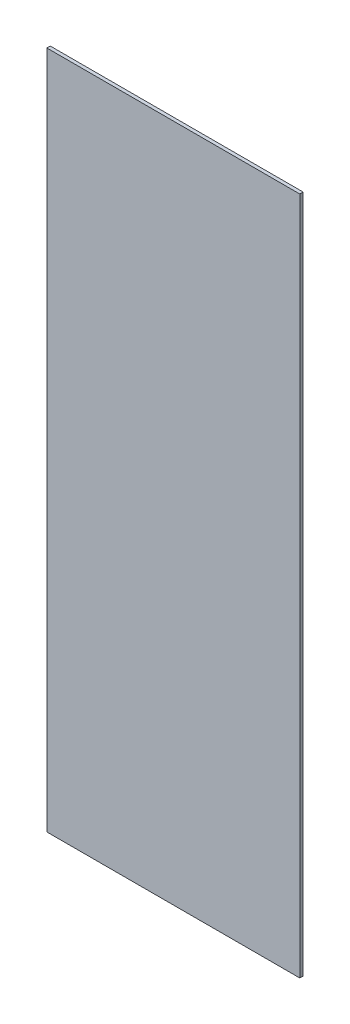
ISO-10303-21;
HEADER;
FILE_DESCRIPTION(('STEP AP214'),'2;1');
FILE_NAME('part.step','',(''),(''),'','','');
FILE_SCHEMA(('AUTOMOTIVE_DESIGN { 1 0 10303 214 1 1 1 1 }'));
ENDSEC;
DATA;
#1=APPLICATION_CONTEXT('core data for automotive mechanical design processes');
#2=APPLICATION_PROTOCOL_DEFINITION('international standard','automotive_design',2000,#1);
#3=PRODUCT_CONTEXT('',#1,'mechanical');
#4=PRODUCT('Part','Part','',(#3));
#5=PRODUCT_RELATED_PRODUCT_CATEGORY('part','',(#4));
#6=PRODUCT_DEFINITION_FORMATION('','',#4);
#7=PRODUCT_DEFINITION_CONTEXT('part definition',#1,'design');
#8=PRODUCT_DEFINITION('design','',#6,#7);
#9=PRODUCT_DEFINITION_SHAPE('','',#8);
#10=(LENGTH_UNIT() NAMED_UNIT(*) SI_UNIT(.MILLI.,.METRE.));
#11=(NAMED_UNIT(*) PLANE_ANGLE_UNIT() SI_UNIT($,.RADIAN.));
#12=(NAMED_UNIT(*) SI_UNIT($,.STERADIAN.) SOLID_ANGLE_UNIT());
#13=UNCERTAINTY_MEASURE_WITH_UNIT(LENGTH_MEASURE(1.E-05),#10,'distance_accuracy_value','');
#14=(GEOMETRIC_REPRESENTATION_CONTEXT(3) GLOBAL_UNCERTAINTY_ASSIGNED_CONTEXT((#13)) GLOBAL_UNIT_ASSIGNED_CONTEXT((#10,
#11,#12)) REPRESENTATION_CONTEXT('',''));
#15=CARTESIAN_POINT('',(0.,0.,0.));
#16=DIRECTION('',(0.,0.,1.));
#17=DIRECTION('',(1.,0.,0.));
#18=AXIS2_PLACEMENT_3D('',#15,#16,#17);
#19=CARTESIAN_POINT('',(74.5,200.,2.));
#20=DIRECTION('',(-1.,0.,0.));
#21=DIRECTION('',(0.,-1.,0.));
#22=AXIS2_PLACEMENT_3D('',#19,#20,#21);
#23=PLANE('',#22);
#24=DIRECTION('',(0.,1.,0.));
#25=VECTOR('',#24,1.);
#26=CARTESIAN_POINT('',(74.5,200.,0.));
#27=LINE('',#26,#25);
#28=CARTESIAN_POINT('',(74.5,-200.,0.));
#29=VERTEX_POINT('',#28);
#30=CARTESIAN_POINT('',(74.5,200.,0.));
#31=VERTEX_POINT('',#30);
#32=EDGE_CURVE('E96',#29,#31,#27,.T.);
#33=ORIENTED_EDGE('',*,*,#32,.T.);
#34=DIRECTION('',(0.,0.,-1.));
#35=VECTOR('',#34,1.);
#36=CARTESIAN_POINT('',(74.5,200.,2.));
#37=LINE('',#36,#35);
#38=CARTESIAN_POINT('',(74.5,200.,2.));
#39=VERTEX_POINT('',#38);
#40=EDGE_CURVE('E11',#39,#31,#37,.T.);
#41=ORIENTED_EDGE('',*,*,#40,.F.);
#42=DIRECTION('',(0.,1.,0.));
#43=VECTOR('',#42,1.);
#44=CARTESIAN_POINT('',(74.5,200.,2.));
#45=LINE('',#44,#43);
#46=CARTESIAN_POINT('',(74.5,-200.,2.));
#47=VERTEX_POINT('',#46);
#48=EDGE_CURVE('E84',#47,#39,#45,.T.);
#49=ORIENTED_EDGE('',*,*,#48,.F.);
#50=DIRECTION('',(0.,0.,-1.));
#51=VECTOR('',#50,1.);
#52=CARTESIAN_POINT('',(74.5,-200.,2.));
#53=LINE('',#52,#51);
#54=EDGE_CURVE('E92',#47,#29,#53,.T.);
#55=ORIENTED_EDGE('',*,*,#54,.T.);
#56=EDGE_LOOP('',(#33,#41,#49,#55));
#57=FACE_BOUND('',#56,.T.);
#58=ADVANCED_FACE('F33',(#57),#23,.F.);
#59=CARTESIAN_POINT('',(-74.5,200.,2.));
#60=DIRECTION('',(0.,-1.,0.));
#61=DIRECTION('',(1.,0.,0.));
#62=AXIS2_PLACEMENT_3D('',#59,#60,#61);
#63=PLANE('',#62);
#64=DIRECTION('',(-1.,0.,0.));
#65=VECTOR('',#64,1.);
#66=CARTESIAN_POINT('',(-74.5,200.,0.));
#67=LINE('',#66,#65);
#68=CARTESIAN_POINT('',(-74.5,200.,0.));
#69=VERTEX_POINT('',#68);
#70=EDGE_CURVE('E88',#31,#69,#67,.T.);
#71=ORIENTED_EDGE('',*,*,#70,.T.);
#72=DIRECTION('',(0.,0.,-1.));
#73=VECTOR('',#72,1.);
#74=CARTESIAN_POINT('',(-74.5,200.,2.));
#75=LINE('',#74,#73);
#76=CARTESIAN_POINT('',(-74.5,200.,2.));
#77=VERTEX_POINT('',#76);
#78=EDGE_CURVE('E41',#77,#69,#75,.T.);
#79=ORIENTED_EDGE('',*,*,#78,.F.);
#80=DIRECTION('',(-1.,0.,0.));
#81=VECTOR('',#80,1.);
#82=CARTESIAN_POINT('',(-74.5,200.,2.));
#83=LINE('',#82,#81);
#84=EDGE_CURVE('E79',#39,#77,#83,.T.);
#85=ORIENTED_EDGE('',*,*,#84,.F.);
#86=ORIENTED_EDGE('',*,*,#40,.T.);
#87=EDGE_LOOP('',(#71,#79,#85,#86));
#88=FACE_BOUND('',#87,.T.);
#89=ADVANCED_FACE('F87',(#88),#63,.F.);
#90=CARTESIAN_POINT('',(-74.5,200.,2.));
#91=DIRECTION('',(1.,0.,0.));
#92=DIRECTION('',(0.,1.,0.));
#93=AXIS2_PLACEMENT_3D('',#90,#91,#92);
#94=PLANE('',#93);
#95=DIRECTION('',(0.,-1.,0.));
#96=VECTOR('',#95,1.);
#97=CARTESIAN_POINT('',(-74.5,200.,0.));
#98=LINE('',#97,#96);
#99=CARTESIAN_POINT('',(-74.5,-200.,0.));
#100=VERTEX_POINT('',#99);
#101=EDGE_CURVE('E66',#69,#100,#98,.T.);
#102=ORIENTED_EDGE('',*,*,#101,.T.);
#103=DIRECTION('',(0.,0.,-1.));
#104=VECTOR('',#103,1.);
#105=CARTESIAN_POINT('',(-74.5,-200.,2.));
#106=LINE('',#105,#104);
#107=CARTESIAN_POINT('',(-74.5,-200.,2.));
#108=VERTEX_POINT('',#107);
#109=EDGE_CURVE('E89',#108,#100,#106,.T.);
#110=ORIENTED_EDGE('',*,*,#109,.F.);
#111=DIRECTION('',(0.,-1.,0.));
#112=VECTOR('',#111,1.);
#113=CARTESIAN_POINT('',(-74.5,200.,2.));
#114=LINE('',#113,#112);
#115=EDGE_CURVE('E82',#77,#108,#114,.T.);
#116=ORIENTED_EDGE('',*,*,#115,.F.);
#117=ORIENTED_EDGE('',*,*,#78,.T.);
#118=EDGE_LOOP('',(#102,#110,#116,#117));
#119=FACE_BOUND('',#118,.T.);
#120=ADVANCED_FACE('F90',(#119),#94,.F.);
#121=CARTESIAN_POINT('',(-74.5,-200.,2.));
#122=DIRECTION('',(0.,1.,0.));
#123=DIRECTION('',(0.,0.,1.));
#124=AXIS2_PLACEMENT_3D('',#121,#122,#123);
#125=PLANE('',#124);
#126=DIRECTION('',(1.,0.,0.));
#127=VECTOR('',#126,1.);
#128=CARTESIAN_POINT('',(-74.5,-200.,0.));
#129=LINE('',#128,#127);
#130=EDGE_CURVE('E72',#100,#29,#129,.T.);
#131=ORIENTED_EDGE('',*,*,#130,.T.);
#132=ORIENTED_EDGE('',*,*,#54,.F.);
#133=DIRECTION('',(1.,0.,0.));
#134=VECTOR('',#133,1.);
#135=CARTESIAN_POINT('',(-74.5,-200.,2.));
#136=LINE('',#135,#134);
#137=EDGE_CURVE('E49',#108,#47,#136,.T.);
#138=ORIENTED_EDGE('',*,*,#137,.F.);
#139=ORIENTED_EDGE('',*,*,#109,.T.);
#140=EDGE_LOOP('',(#131,#132,#138,#139));
#141=FACE_BOUND('',#140,.T.);
#142=ADVANCED_FACE('F103',(#141),#125,.F.);
#143=CARTESIAN_POINT('',(0.,0.,2.));
#144=DIRECTION('',(0.,0.,1.));
#145=DIRECTION('',(1.,0.,0.));
#146=AXIS2_PLACEMENT_3D('',#143,#144,#145);
#147=PLANE('',#146);
#148=ORIENTED_EDGE('',*,*,#48,.T.);
#149=ORIENTED_EDGE('',*,*,#84,.T.);
#150=ORIENTED_EDGE('',*,*,#115,.T.);
#151=ORIENTED_EDGE('',*,*,#137,.T.);
#152=EDGE_LOOP('',(#148,#149,#150,#151));
#153=FACE_BOUND('',#152,.T.);
#154=ADVANCED_FACE('F80',(#153),#147,.T.);
#155=CARTESIAN_POINT('',(0.,0.,0.));
#156=DIRECTION('',(0.,0.,1.));
#157=DIRECTION('',(1.,0.,0.));
#158=AXIS2_PLACEMENT_3D('',#155,#156,#157);
#159=PLANE('',#158);
#160=ORIENTED_EDGE('',*,*,#32,.F.);
#161=ORIENTED_EDGE('',*,*,#130,.F.);
#162=ORIENTED_EDGE('',*,*,#101,.F.);
#163=ORIENTED_EDGE('',*,*,#70,.F.);
#164=EDGE_LOOP('',(#160,#161,#162,#163));
#165=FACE_BOUND('',#164,.T.);
#166=ADVANCED_FACE('F106',(#165),#159,.F.);
#167=CLOSED_SHELL('',(#58,#89,#120,#142,#154,#166));
#168=MANIFOLD_SOLID_BREP('B2',#167);
#169=ADVANCED_BREP_SHAPE_REPRESENTATION('',(#18,#168),#14);
#170=SHAPE_DEFINITION_REPRESENTATION(#9,#169);
ENDSEC;
END-ISO-10303-21;
